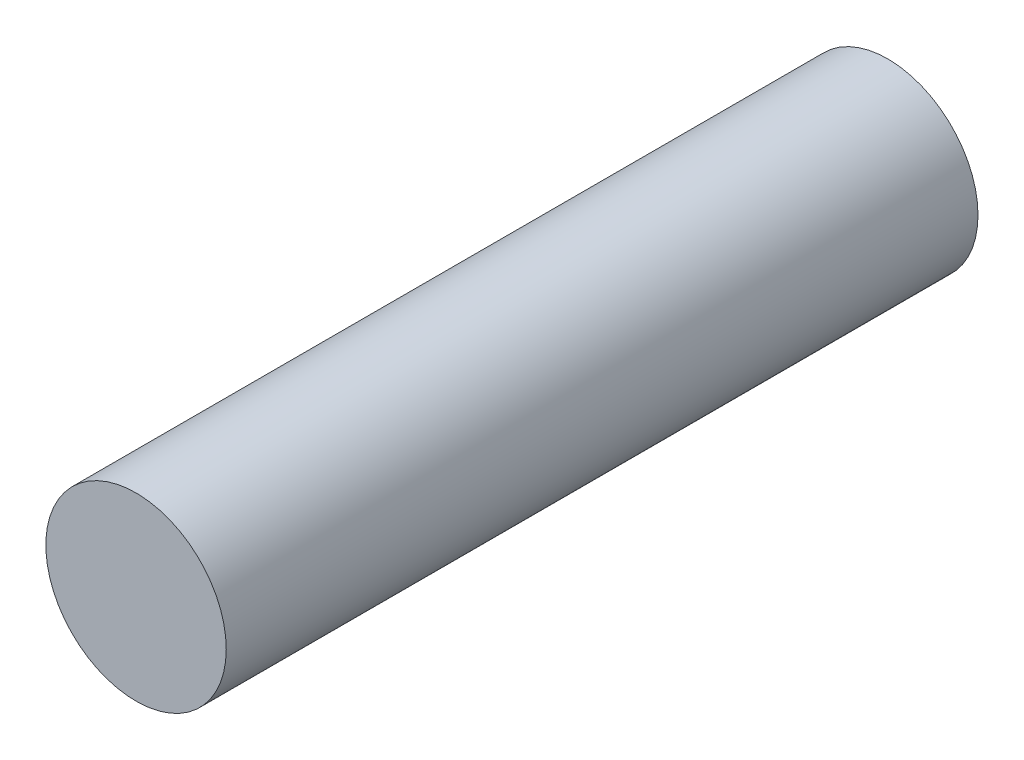
ISO-10303-21;
HEADER;
FILE_DESCRIPTION(('STEP AP214'),'2;1');
FILE_NAME('part.step','',(''),(''),'','','');
FILE_SCHEMA(('AUTOMOTIVE_DESIGN { 1 0 10303 214 1 1 1 1 }'));
ENDSEC;
DATA;
#1=APPLICATION_CONTEXT('core data for automotive mechanical design processes');
#2=APPLICATION_PROTOCOL_DEFINITION('international standard','automotive_design',2000,#1);
#3=PRODUCT_CONTEXT('',#1,'mechanical');
#4=PRODUCT('Part','Part','',(#3));
#5=PRODUCT_RELATED_PRODUCT_CATEGORY('part','',(#4));
#6=PRODUCT_DEFINITION_FORMATION('','',#4);
#7=PRODUCT_DEFINITION_CONTEXT('part definition',#1,'design');
#8=PRODUCT_DEFINITION('design','',#6,#7);
#9=PRODUCT_DEFINITION_SHAPE('','',#8);
#10=(LENGTH_UNIT() NAMED_UNIT(*) SI_UNIT(.MILLI.,.METRE.));
#11=(NAMED_UNIT(*) PLANE_ANGLE_UNIT() SI_UNIT($,.RADIAN.));
#12=(NAMED_UNIT(*) SI_UNIT($,.STERADIAN.) SOLID_ANGLE_UNIT());
#13=UNCERTAINTY_MEASURE_WITH_UNIT(LENGTH_MEASURE(1.E-05),#10,'distance_accuracy_value','');
#14=(GEOMETRIC_REPRESENTATION_CONTEXT(3) GLOBAL_UNCERTAINTY_ASSIGNED_CONTEXT((#13)) GLOBAL_UNIT_ASSIGNED_CONTEXT((#10,
#11,#12)) REPRESENTATION_CONTEXT('',''));
#15=CARTESIAN_POINT('',(0.,0.,0.));
#16=DIRECTION('',(0.,0.,1.));
#17=DIRECTION('',(1.,0.,0.));
#18=AXIS2_PLACEMENT_3D('',#15,#16,#17);
#19=CARTESIAN_POINT('',(0.,0.,100.));
#20=DIRECTION('',(0.,0.,-1.));
#21=DIRECTION('',(-1.,0.,0.));
#22=AXIS2_PLACEMENT_3D('',#19,#20,#21);
#23=CYLINDRICAL_SURFACE('',#22,12.);
#24=CARTESIAN_POINT('',(0.,0.,100.));
#25=DIRECTION('',(0.,0.,1.));
#26=DIRECTION('',(1.,0.,0.));
#27=AXIS2_PLACEMENT_3D('',#24,#25,#26);
#28=CIRCLE('',#27,12.);
#29=CARTESIAN_POINT('',(12.,0.,100.));
#30=VERTEX_POINT('',#29);
#31=EDGE_CURVE('E10',#30,#30,#28,.T.);
#32=ORIENTED_EDGE('',*,*,#31,.F.);
#33=EDGE_LOOP('',(#32));
#34=FACE_BOUND('',#33,.T.);
#35=CARTESIAN_POINT('',(0.,0.,0.));
#36=DIRECTION('',(0.,0.,1.));
#37=DIRECTION('',(1.,0.,0.));
#38=AXIS2_PLACEMENT_3D('',#35,#36,#37);
#39=CIRCLE('',#38,12.);
#40=CARTESIAN_POINT('',(12.,0.,0.));
#41=VERTEX_POINT('',#40);
#42=EDGE_CURVE('E40',#41,#41,#39,.T.);
#43=ORIENTED_EDGE('',*,*,#42,.T.);
#44=EDGE_LOOP('',(#43));
#45=FACE_BOUND('',#44,.T.);
#46=ADVANCED_FACE('F37',(#34,#45),#23,.T.);
#47=CARTESIAN_POINT('',(0.,0.,100.));
#48=DIRECTION('',(0.,0.,1.));
#49=DIRECTION('',(1.,0.,0.));
#50=AXIS2_PLACEMENT_3D('',#47,#48,#49);
#51=PLANE('',#50);
#52=ORIENTED_EDGE('',*,*,#31,.T.);
#53=EDGE_LOOP('',(#52));
#54=FACE_BOUND('',#53,.T.);
#55=ADVANCED_FACE('F54',(#54),#51,.T.);
#56=CARTESIAN_POINT('',(0.,0.,0.));
#57=DIRECTION('',(0.,0.,1.));
#58=DIRECTION('',(1.,0.,0.));
#59=AXIS2_PLACEMENT_3D('',#56,#57,#58);
#60=PLANE('',#59);
#61=ORIENTED_EDGE('',*,*,#42,.F.);
#62=EDGE_LOOP('',(#61));
#63=FACE_BOUND('',#62,.T.);
#64=ADVANCED_FACE('F52',(#63),#60,.F.);
#65=CLOSED_SHELL('',(#46,#55,#64));
#66=MANIFOLD_SOLID_BREP('B2',#65);
#67=ADVANCED_BREP_SHAPE_REPRESENTATION('',(#18,#66),#14);
#68=SHAPE_DEFINITION_REPRESENTATION(#9,#67);
ENDSEC;
END-ISO-10303-21;
